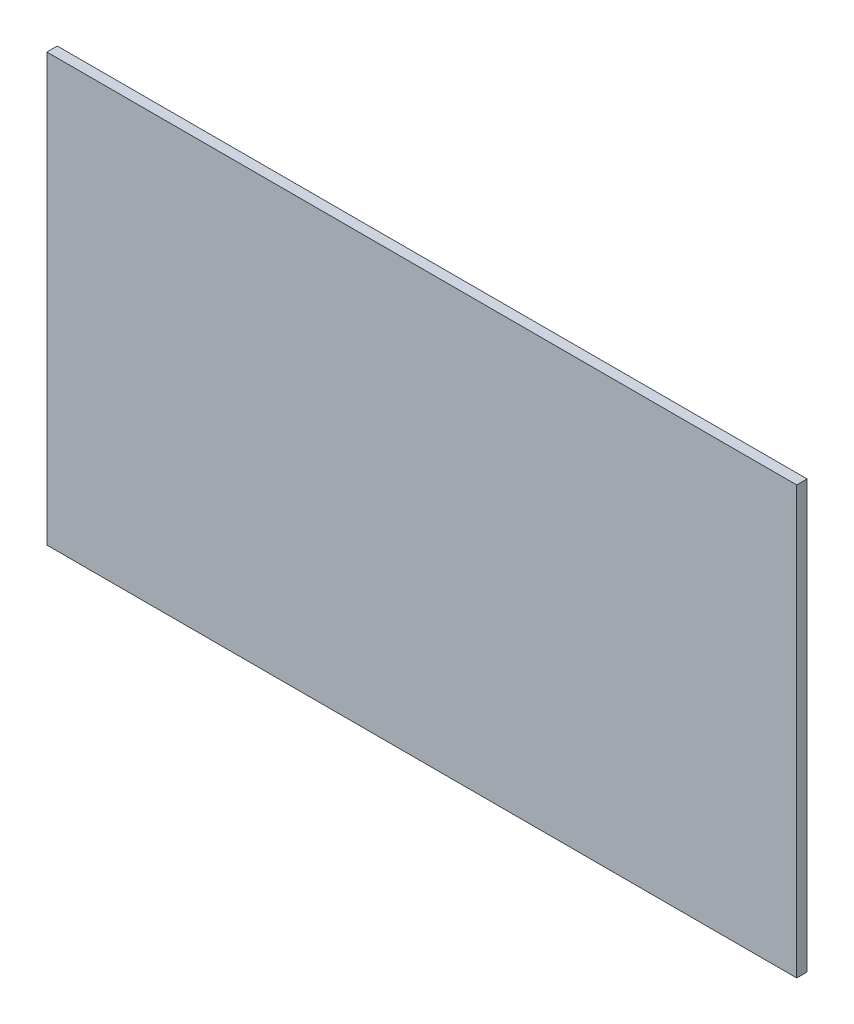
ISO-10303-21;
HEADER;
FILE_DESCRIPTION(('STEP AP214'),'2;1');
FILE_NAME('part.step','',(''),(''),'','','');
FILE_SCHEMA(('AUTOMOTIVE_DESIGN { 1 0 10303 214 1 1 1 1 }'));
ENDSEC;
DATA;
#1=APPLICATION_CONTEXT('core data for automotive mechanical design processes');
#2=APPLICATION_PROTOCOL_DEFINITION('international standard','automotive_design',2000,#1);
#3=PRODUCT_CONTEXT('',#1,'mechanical');
#4=PRODUCT('Part','Part','',(#3));
#5=PRODUCT_RELATED_PRODUCT_CATEGORY('part','',(#4));
#6=PRODUCT_DEFINITION_FORMATION('','',#4);
#7=PRODUCT_DEFINITION_CONTEXT('part definition',#1,'design');
#8=PRODUCT_DEFINITION('design','',#6,#7);
#9=PRODUCT_DEFINITION_SHAPE('','',#8);
#10=(LENGTH_UNIT() NAMED_UNIT(*) SI_UNIT(.MILLI.,.METRE.));
#11=(NAMED_UNIT(*) PLANE_ANGLE_UNIT() SI_UNIT($,.RADIAN.));
#12=(NAMED_UNIT(*) SI_UNIT($,.STERADIAN.) SOLID_ANGLE_UNIT());
#13=UNCERTAINTY_MEASURE_WITH_UNIT(LENGTH_MEASURE(1.E-05),#10,'distance_accuracy_value','');
#14=(GEOMETRIC_REPRESENTATION_CONTEXT(3) GLOBAL_UNCERTAINTY_ASSIGNED_CONTEXT((#13)) GLOBAL_UNIT_ASSIGNED_CONTEXT((#10,
#11,#12)) REPRESENTATION_CONTEXT('',''));
#15=CARTESIAN_POINT('',(0.,0.,0.));
#16=DIRECTION('',(0.,0.,1.));
#17=DIRECTION('',(1.,0.,0.));
#18=AXIS2_PLACEMENT_3D('',#15,#16,#17);
#19=CARTESIAN_POINT('',(-914.4,520.7,25.4));
#20=DIRECTION('',(1.,0.,0.));
#21=DIRECTION('',(0.,1.,0.));
#22=AXIS2_PLACEMENT_3D('',#19,#20,#21);
#23=PLANE('',#22);
#24=DIRECTION('',(0.,-1.,0.));
#25=VECTOR('',#24,1.);
#26=CARTESIAN_POINT('',(-914.4,520.7,0.));
#27=LINE('',#26,#25);
#28=CARTESIAN_POINT('',(-914.4,520.7,0.));
#29=VERTEX_POINT('',#28);
#30=CARTESIAN_POINT('',(-914.4,-520.7,0.));
#31=VERTEX_POINT('',#30);
#32=EDGE_CURVE('E95',#29,#31,#27,.T.);
#33=ORIENTED_EDGE('',*,*,#32,.T.);
#34=DIRECTION('',(0.,0.,-1.));
#35=VECTOR('',#34,1.);
#36=CARTESIAN_POINT('',(-914.4,-520.7,25.4));
#37=LINE('',#36,#35);
#38=CARTESIAN_POINT('',(-914.4,-520.7,25.4));
#39=VERTEX_POINT('',#38);
#40=EDGE_CURVE('E11',#39,#31,#37,.T.);
#41=ORIENTED_EDGE('',*,*,#40,.F.);
#42=DIRECTION('',(0.,-1.,0.));
#43=VECTOR('',#42,1.);
#44=CARTESIAN_POINT('',(-914.4,520.7,25.4));
#45=LINE('',#44,#43);
#46=CARTESIAN_POINT('',(-914.4,520.7,25.4));
#47=VERTEX_POINT('',#46);
#48=EDGE_CURVE('E83',#47,#39,#45,.T.);
#49=ORIENTED_EDGE('',*,*,#48,.F.);
#50=DIRECTION('',(0.,0.,-1.));
#51=VECTOR('',#50,1.);
#52=CARTESIAN_POINT('',(-914.4,520.7,25.4));
#53=LINE('',#52,#51);
#54=EDGE_CURVE('E91',#47,#29,#53,.T.);
#55=ORIENTED_EDGE('',*,*,#54,.T.);
#56=EDGE_LOOP('',(#33,#41,#49,#55));
#57=FACE_BOUND('',#56,.T.);
#58=ADVANCED_FACE('F32',(#57),#23,.F.);
#59=CARTESIAN_POINT('',(914.4,-520.7,25.4));
#60=DIRECTION('',(0.,1.,0.));
#61=DIRECTION('',(-1.,0.,0.));
#62=AXIS2_PLACEMENT_3D('',#59,#60,#61);
#63=PLANE('',#62);
#64=DIRECTION('',(1.,0.,0.));
#65=VECTOR('',#64,1.);
#66=CARTESIAN_POINT('',(914.4,-520.7,0.));
#67=LINE('',#66,#65);
#68=CARTESIAN_POINT('',(914.4,-520.7,0.));
#69=VERTEX_POINT('',#68);
#70=EDGE_CURVE('E87',#31,#69,#67,.T.);
#71=ORIENTED_EDGE('',*,*,#70,.T.);
#72=DIRECTION('',(0.,0.,-1.));
#73=VECTOR('',#72,1.);
#74=CARTESIAN_POINT('',(914.4,-520.7,25.4));
#75=LINE('',#74,#73);
#76=CARTESIAN_POINT('',(914.4,-520.7,25.4));
#77=VERTEX_POINT('',#76);
#78=EDGE_CURVE('E40',#77,#69,#75,.T.);
#79=ORIENTED_EDGE('',*,*,#78,.F.);
#80=DIRECTION('',(1.,0.,0.));
#81=VECTOR('',#80,1.);
#82=CARTESIAN_POINT('',(914.4,-520.7,25.4));
#83=LINE('',#82,#81);
#84=EDGE_CURVE('E78',#39,#77,#83,.T.);
#85=ORIENTED_EDGE('',*,*,#84,.F.);
#86=ORIENTED_EDGE('',*,*,#40,.T.);
#87=EDGE_LOOP('',(#71,#79,#85,#86));
#88=FACE_BOUND('',#87,.T.);
#89=ADVANCED_FACE('F86',(#88),#63,.F.);
#90=CARTESIAN_POINT('',(914.4,520.7,25.4));
#91=DIRECTION('',(-1.,0.,0.));
#92=DIRECTION('',(0.,0.,1.));
#93=AXIS2_PLACEMENT_3D('',#90,#91,#92);
#94=PLANE('',#93);
#95=DIRECTION('',(0.,1.,0.));
#96=VECTOR('',#95,1.);
#97=CARTESIAN_POINT('',(914.4,520.7,0.));
#98=LINE('',#97,#96);
#99=CARTESIAN_POINT('',(914.4,520.7,0.));
#100=VERTEX_POINT('',#99);
#101=EDGE_CURVE('E65',#69,#100,#98,.T.);
#102=ORIENTED_EDGE('',*,*,#101,.T.);
#103=DIRECTION('',(0.,0.,-1.));
#104=VECTOR('',#103,1.);
#105=CARTESIAN_POINT('',(914.4,520.7,25.4));
#106=LINE('',#105,#104);
#107=CARTESIAN_POINT('',(914.4,520.7,25.4));
#108=VERTEX_POINT('',#107);
#109=EDGE_CURVE('E88',#108,#100,#106,.T.);
#110=ORIENTED_EDGE('',*,*,#109,.F.);
#111=DIRECTION('',(0.,1.,0.));
#112=VECTOR('',#111,1.);
#113=CARTESIAN_POINT('',(914.4,520.7,25.4));
#114=LINE('',#113,#112);
#115=EDGE_CURVE('E81',#77,#108,#114,.T.);
#116=ORIENTED_EDGE('',*,*,#115,.F.);
#117=ORIENTED_EDGE('',*,*,#78,.T.);
#118=EDGE_LOOP('',(#102,#110,#116,#117));
#119=FACE_BOUND('',#118,.T.);
#120=ADVANCED_FACE('F89',(#119),#94,.F.);
#121=CARTESIAN_POINT('',(914.4,520.7,25.4));
#122=DIRECTION('',(0.,-1.,0.));
#123=DIRECTION('',(1.,0.,0.));
#124=AXIS2_PLACEMENT_3D('',#121,#122,#123);
#125=PLANE('',#124);
#126=DIRECTION('',(-1.,0.,0.));
#127=VECTOR('',#126,1.);
#128=CARTESIAN_POINT('',(914.4,520.7,0.));
#129=LINE('',#128,#127);
#130=EDGE_CURVE('E71',#100,#29,#129,.T.);
#131=ORIENTED_EDGE('',*,*,#130,.T.);
#132=ORIENTED_EDGE('',*,*,#54,.F.);
#133=DIRECTION('',(-1.,0.,0.));
#134=VECTOR('',#133,1.);
#135=CARTESIAN_POINT('',(914.4,520.7,25.4));
#136=LINE('',#135,#134);
#137=EDGE_CURVE('E48',#108,#47,#136,.T.);
#138=ORIENTED_EDGE('',*,*,#137,.F.);
#139=ORIENTED_EDGE('',*,*,#109,.T.);
#140=EDGE_LOOP('',(#131,#132,#138,#139));
#141=FACE_BOUND('',#140,.T.);
#142=ADVANCED_FACE('F102',(#141),#125,.F.);
#143=CARTESIAN_POINT('',(0.,0.,25.4));
#144=DIRECTION('',(0.,0.,-1.));
#145=DIRECTION('',(-1.,0.,0.));
#146=AXIS2_PLACEMENT_3D('',#143,#144,#145);
#147=PLANE('',#146);
#148=ORIENTED_EDGE('',*,*,#48,.T.);
#149=ORIENTED_EDGE('',*,*,#84,.T.);
#150=ORIENTED_EDGE('',*,*,#115,.T.);
#151=ORIENTED_EDGE('',*,*,#137,.T.);
#152=EDGE_LOOP('',(#148,#149,#150,#151));
#153=FACE_BOUND('',#152,.T.);
#154=ADVANCED_FACE('F79',(#153),#147,.F.);
#155=CARTESIAN_POINT('',(0.,0.,0.));
#156=DIRECTION('',(0.,0.,-1.));
#157=DIRECTION('',(-1.,0.,0.));
#158=AXIS2_PLACEMENT_3D('',#155,#156,#157);
#159=PLANE('',#158);
#160=ORIENTED_EDGE('',*,*,#32,.F.);
#161=ORIENTED_EDGE('',*,*,#130,.F.);
#162=ORIENTED_EDGE('',*,*,#101,.F.);
#163=ORIENTED_EDGE('',*,*,#70,.F.);
#164=EDGE_LOOP('',(#160,#161,#162,#163));
#165=FACE_BOUND('',#164,.T.);
#166=ADVANCED_FACE('F105',(#165),#159,.T.);
#167=CLOSED_SHELL('',(#58,#89,#120,#142,#154,#166));
#168=MANIFOLD_SOLID_BREP('B2',#167);
#169=ADVANCED_BREP_SHAPE_REPRESENTATION('',(#18,#168),#14);
#170=SHAPE_DEFINITION_REPRESENTATION(#9,#169);
ENDSEC;
END-ISO-10303-21;
